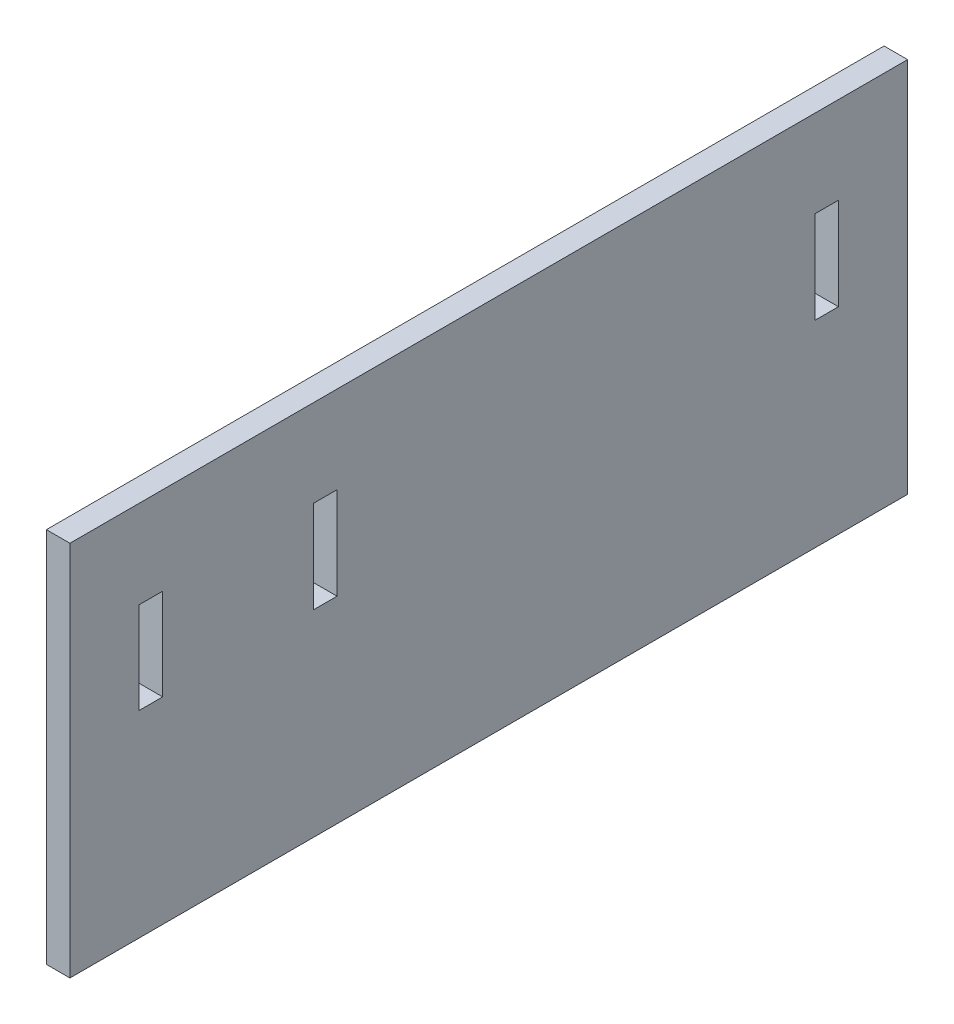
ISO-10303-21;
HEADER;
FILE_DESCRIPTION(('STEP AP214'),'2;1');
FILE_NAME('part.step','',(''),(''),'','','');
FILE_SCHEMA(('AUTOMOTIVE_DESIGN { 1 0 10303 214 1 1 1 1 }'));
ENDSEC;
DATA;
#1=APPLICATION_CONTEXT('core data for automotive mechanical design processes');
#2=APPLICATION_PROTOCOL_DEFINITION('international standard','automotive_design',2000,#1);
#3=PRODUCT_CONTEXT('',#1,'mechanical');
#4=PRODUCT('Part','Part','',(#3));
#5=PRODUCT_RELATED_PRODUCT_CATEGORY('part','',(#4));
#6=PRODUCT_DEFINITION_FORMATION('','',#4);
#7=PRODUCT_DEFINITION_CONTEXT('part definition',#1,'design');
#8=PRODUCT_DEFINITION('design','',#6,#7);
#9=PRODUCT_DEFINITION_SHAPE('','',#8);
#10=(LENGTH_UNIT() NAMED_UNIT(*) SI_UNIT(.MILLI.,.METRE.));
#11=(NAMED_UNIT(*) PLANE_ANGLE_UNIT() SI_UNIT($,.RADIAN.));
#12=(NAMED_UNIT(*) SI_UNIT($,.STERADIAN.) SOLID_ANGLE_UNIT());
#13=UNCERTAINTY_MEASURE_WITH_UNIT(LENGTH_MEASURE(1.E-05),#10,'distance_accuracy_value','');
#14=(GEOMETRIC_REPRESENTATION_CONTEXT(3) GLOBAL_UNCERTAINTY_ASSIGNED_CONTEXT((#13)) GLOBAL_UNIT_ASSIGNED_CONTEXT((#10,
#11,#12)) REPRESENTATION_CONTEXT('',''));
#15=CARTESIAN_POINT('',(0.,0.,0.));
#16=DIRECTION('',(0.,0.,1.));
#17=DIRECTION('',(1.,0.,0.));
#18=AXIS2_PLACEMENT_3D('',#15,#16,#17);
#19=CARTESIAN_POINT('',(2.7,-12.68,1.16249999999997));
#20=DIRECTION('',(1.,0.,0.));
#21=DIRECTION('',(0.,0.,-1.));
#22=AXIS2_PLACEMENT_3D('',#19,#20,#21);
#23=PLANE('',#22);
#24=DIRECTION('',(0.,0.,-1.));
#25=VECTOR('',#24,1.);
#26=CARTESIAN_POINT('',(2.7,9.92264253126034,-26.775));
#27=LINE('',#26,#25);
#28=CARTESIAN_POINT('',(2.7,9.92264253126034,-26.775));
#29=VERTEX_POINT('',#28);
#30=CARTESIAN_POINT('',(2.7,9.92264253126034,-29.475));
#31=VERTEX_POINT('',#30);
#32=EDGE_CURVE('E184',#29,#31,#27,.T.);
#33=ORIENTED_EDGE('',*,*,#32,.F.);
#34=DIRECTION('',(0.,-1.,0.));
#35=VECTOR('',#34,1.);
#36=CARTESIAN_POINT('',(2.7,20.50183849,-26.775));
#37=LINE('',#36,#35);
#38=CARTESIAN_POINT('',(2.7,20.50183849,-26.775));
#39=VERTEX_POINT('',#38);
#40=EDGE_CURVE('E182',#39,#29,#37,.T.);
#41=ORIENTED_EDGE('',*,*,#40,.F.);
#42=DIRECTION('',(0.,0.,1.));
#43=VECTOR('',#42,1.);
#44=CARTESIAN_POINT('',(2.7,20.50183849,-26.775));
#45=LINE('',#44,#43);
#46=CARTESIAN_POINT('',(2.7,20.50183849,-29.475));
#47=VERTEX_POINT('',#46);
#48=EDGE_CURVE('E190',#47,#39,#45,.T.);
#49=ORIENTED_EDGE('',*,*,#48,.F.);
#50=DIRECTION('',(0.,1.,0.));
#51=VECTOR('',#50,1.);
#52=CARTESIAN_POINT('',(2.7,20.50183849,-29.475));
#53=LINE('',#52,#51);
#54=EDGE_CURVE('E187',#31,#47,#53,.T.);
#55=ORIENTED_EDGE('',*,*,#54,.F.);
#56=EDGE_LOOP('',(#33,#41,#49,#55));
#57=FACE_BOUND('',#56,.T.);
#58=DIRECTION('',(0.,0.,-1.));
#59=VECTOR('',#58,1.);
#60=CARTESIAN_POINT('',(2.7,-12.68,-6.77500000000003));
#61=LINE('',#60,#59);
#62=CARTESIAN_POINT('',(2.7,-12.68,1.16249999999997));
#63=VERTEX_POINT('',#62);
#64=CARTESIAN_POINT('',(2.7,-12.68,-94.9125));
#65=VERTEX_POINT('',#64);
#66=EDGE_CURVE('E244',#63,#65,#61,.T.);
#67=ORIENTED_EDGE('',*,*,#66,.T.);
#68=DIRECTION('',(0.,1.,0.));
#69=VECTOR('',#68,1.);
#70=CARTESIAN_POINT('',(2.7,30.5,-94.9125));
#71=LINE('',#70,#69);
#72=CARTESIAN_POINT('',(2.7,30.5,-94.9125));
#73=VERTEX_POINT('',#72);
#74=EDGE_CURVE('E246',#65,#73,#71,.T.);
#75=ORIENTED_EDGE('',*,*,#74,.T.);
#76=DIRECTION('',(0.,0.,1.));
#77=VECTOR('',#76,1.);
#78=CARTESIAN_POINT('',(2.7,30.5,-83.4125));
#79=LINE('',#78,#77);
#80=CARTESIAN_POINT('',(2.7,30.5,1.16249999999997));
#81=VERTEX_POINT('',#80);
#82=EDGE_CURVE('E249',#73,#81,#79,.T.);
#83=ORIENTED_EDGE('',*,*,#82,.T.);
#84=DIRECTION('',(0.,-1.,0.));
#85=VECTOR('',#84,1.);
#86=CARTESIAN_POINT('',(2.7,30.5,1.16249999999997));
#87=LINE('',#86,#85);
#88=EDGE_CURVE('E251',#81,#63,#87,.T.);
#89=ORIENTED_EDGE('',*,*,#88,.T.);
#90=EDGE_LOOP('',(#67,#75,#83,#89));
#91=FACE_BOUND('',#90,.T.);
#92=DIRECTION('',(0.,0.,-1.));
#93=VECTOR('',#92,1.);
#94=CARTESIAN_POINT('',(2.7,9.92264253126034,-6.77500000000003));
#95=LINE('',#94,#93);
#96=CARTESIAN_POINT('',(2.7,9.92264253126034,-6.77500000000003));
#97=VERTEX_POINT('',#96);
#98=CARTESIAN_POINT('',(2.7,9.92264253126034,-9.47500000000004));
#99=VERTEX_POINT('',#98);
#100=EDGE_CURVE('E215',#97,#99,#95,.T.);
#101=ORIENTED_EDGE('',*,*,#100,.F.);
#102=DIRECTION('',(0.,-1.,0.));
#103=VECTOR('',#102,1.);
#104=CARTESIAN_POINT('',(2.7,20.4226425312603,-6.77500000000003));
#105=LINE('',#104,#103);
#106=CARTESIAN_POINT('',(2.7,20.4226425312603,-6.77500000000003));
#107=VERTEX_POINT('',#106);
#108=EDGE_CURVE('E213',#107,#97,#105,.T.);
#109=ORIENTED_EDGE('',*,*,#108,.F.);
#110=DIRECTION('',(0.,0.,1.));
#111=VECTOR('',#110,1.);
#112=CARTESIAN_POINT('',(2.7,20.4226425312603,-9.47500000000003));
#113=LINE('',#112,#111);
#114=CARTESIAN_POINT('',(2.7,20.4226425312603,-9.47500000000003));
#115=VERTEX_POINT('',#114);
#116=EDGE_CURVE('E221',#115,#107,#113,.T.);
#117=ORIENTED_EDGE('',*,*,#116,.F.);
#118=DIRECTION('',(0.,1.,0.));
#119=VECTOR('',#118,1.);
#120=CARTESIAN_POINT('',(2.7,9.92264253126034,-9.47500000000004));
#121=LINE('',#120,#119);
#122=EDGE_CURVE('E218',#99,#115,#121,.T.);
#123=ORIENTED_EDGE('',*,*,#122,.F.);
#124=EDGE_LOOP('',(#101,#109,#117,#123));
#125=FACE_BOUND('',#124,.T.);
#126=DIRECTION('',(0.,0.,1.));
#127=VECTOR('',#126,1.);
#128=CARTESIAN_POINT('',(2.7,20.50183849,-86.975));
#129=LINE('',#128,#127);
#130=CARTESIAN_POINT('',(2.7,20.50183849,-86.975));
#131=VERTEX_POINT('',#130);
#132=CARTESIAN_POINT('',(2.7,20.50183849,-84.275));
#133=VERTEX_POINT('',#132);
#134=EDGE_CURVE('E154',#131,#133,#129,.T.);
#135=ORIENTED_EDGE('',*,*,#134,.F.);
#136=DIRECTION('',(0.,1.,0.));
#137=VECTOR('',#136,1.);
#138=CARTESIAN_POINT('',(2.7,20.50183849,-86.975));
#139=LINE('',#138,#137);
#140=CARTESIAN_POINT('',(2.7,9.92264253126034,-86.975));
#141=VERTEX_POINT('',#140);
#142=EDGE_CURVE('E146',#141,#131,#139,.T.);
#143=ORIENTED_EDGE('',*,*,#142,.F.);
#144=DIRECTION('',(0.,0.,-1.));
#145=VECTOR('',#144,1.);
#146=CARTESIAN_POINT('',(2.7,9.92264253126034,-84.275));
#147=LINE('',#146,#145);
#148=CARTESIAN_POINT('',(2.7,9.92264253126034,-84.275));
#149=VERTEX_POINT('',#148);
#150=EDGE_CURVE('E168',#149,#141,#147,.T.);
#151=ORIENTED_EDGE('',*,*,#150,.F.);
#152=DIRECTION('',(0.,-1.,0.));
#153=VECTOR('',#152,1.);
#154=CARTESIAN_POINT('',(2.7,20.50183849,-84.275));
#155=LINE('',#154,#153);
#156=EDGE_CURVE('E166',#133,#149,#155,.T.);
#157=ORIENTED_EDGE('',*,*,#156,.F.);
#158=EDGE_LOOP('',(#135,#143,#151,#157));
#159=FACE_BOUND('',#158,.T.);
#160=ADVANCED_FACE('F33',(#57,#91,#125,#159),#23,.T.);
#161=CARTESIAN_POINT('',(0.,-12.68,1.16249999999997));
#162=DIRECTION('',(1.,0.,0.));
#163=DIRECTION('',(0.,0.,-1.));
#164=AXIS2_PLACEMENT_3D('',#161,#162,#163);
#165=PLANE('',#164);
#166=DIRECTION('',(0.,-1.,0.));
#167=VECTOR('',#166,1.);
#168=CARTESIAN_POINT('',(0.,20.50183849,-26.775));
#169=LINE('',#168,#167);
#170=CARTESIAN_POINT('',(0.,20.50183849,-26.775));
#171=VERTEX_POINT('',#170);
#172=CARTESIAN_POINT('',(0.,9.92264253126034,-26.775));
#173=VERTEX_POINT('',#172);
#174=EDGE_CURVE('E162',#171,#173,#169,.T.);
#175=ORIENTED_EDGE('',*,*,#174,.T.);
#176=DIRECTION('',(0.,0.,-1.));
#177=VECTOR('',#176,1.);
#178=CARTESIAN_POINT('',(0.,9.92264253126034,-26.775));
#179=LINE('',#178,#177);
#180=CARTESIAN_POINT('',(0.,9.92264253126034,-29.475));
#181=VERTEX_POINT('',#180);
#182=EDGE_CURVE('E195',#173,#181,#179,.T.);
#183=ORIENTED_EDGE('',*,*,#182,.T.);
#184=DIRECTION('',(0.,1.,0.));
#185=VECTOR('',#184,1.);
#186=CARTESIAN_POINT('',(0.,20.50183849,-29.475));
#187=LINE('',#186,#185);
#188=CARTESIAN_POINT('',(0.,20.50183849,-29.475));
#189=VERTEX_POINT('',#188);
#190=EDGE_CURVE('E198',#181,#189,#187,.T.);
#191=ORIENTED_EDGE('',*,*,#190,.T.);
#192=DIRECTION('',(0.,0.,1.));
#193=VECTOR('',#192,1.);
#194=CARTESIAN_POINT('',(0.,20.50183849,-26.775));
#195=LINE('',#194,#193);
#196=EDGE_CURVE('E185',#189,#171,#195,.T.);
#197=ORIENTED_EDGE('',*,*,#196,.T.);
#198=EDGE_LOOP('',(#175,#183,#191,#197));
#199=FACE_BOUND('',#198,.T.);
#200=DIRECTION('',(0.,0.,-1.));
#201=VECTOR('',#200,1.);
#202=CARTESIAN_POINT('',(0.,-12.68,-86.975));
#203=LINE('',#202,#201);
#204=CARTESIAN_POINT('',(0.,-12.68,1.16249999999997));
#205=VERTEX_POINT('',#204);
#206=CARTESIAN_POINT('',(0.,-12.68,-94.9125));
#207=VERTEX_POINT('',#206);
#208=EDGE_CURVE('E243',#205,#207,#203,.T.);
#209=ORIENTED_EDGE('',*,*,#208,.F.);
#210=DIRECTION('',(0.,-1.,0.));
#211=VECTOR('',#210,1.);
#212=CARTESIAN_POINT('',(0.,30.5,1.16249999999997));
#213=LINE('',#212,#211);
#214=CARTESIAN_POINT('',(0.,30.5,1.16249999999997));
#215=VERTEX_POINT('',#214);
#216=EDGE_CURVE('E247',#215,#205,#213,.T.);
#217=ORIENTED_EDGE('',*,*,#216,.F.);
#218=DIRECTION('',(0.,0.,1.));
#219=VECTOR('',#218,1.);
#220=CARTESIAN_POINT('',(0.,30.5,-3.21249999999999));
#221=LINE('',#220,#219);
#222=CARTESIAN_POINT('',(0.,30.5,-94.9125));
#223=VERTEX_POINT('',#222);
#224=EDGE_CURVE('E258',#223,#215,#221,.T.);
#225=ORIENTED_EDGE('',*,*,#224,.F.);
#226=DIRECTION('',(0.,1.,0.));
#227=VECTOR('',#226,1.);
#228=CARTESIAN_POINT('',(0.,30.5,-94.9125));
#229=LINE('',#228,#227);
#230=EDGE_CURVE('E255',#207,#223,#229,.T.);
#231=ORIENTED_EDGE('',*,*,#230,.F.);
#232=EDGE_LOOP('',(#209,#217,#225,#231));
#233=FACE_BOUND('',#232,.T.);
#234=DIRECTION('',(0.,-1.,0.));
#235=VECTOR('',#234,1.);
#236=CARTESIAN_POINT('',(0.,20.4226425312603,-6.77500000000003));
#237=LINE('',#236,#235);
#238=CARTESIAN_POINT('',(0.,20.4226425312603,-6.77500000000003));
#239=VERTEX_POINT('',#238);
#240=CARTESIAN_POINT('',(0.,9.92264253126034,-6.77500000000003));
#241=VERTEX_POINT('',#240);
#242=EDGE_CURVE('E212',#239,#241,#237,.T.);
#243=ORIENTED_EDGE('',*,*,#242,.T.);
#244=DIRECTION('',(0.,0.,-1.));
#245=VECTOR('',#244,1.);
#246=CARTESIAN_POINT('',(0.,9.92264253126034,-6.77500000000003));
#247=LINE('',#246,#245);
#248=CARTESIAN_POINT('',(0.,9.92264253126034,-9.47500000000004));
#249=VERTEX_POINT('',#248);
#250=EDGE_CURVE('E226',#241,#249,#247,.T.);
#251=ORIENTED_EDGE('',*,*,#250,.T.);
#252=DIRECTION('',(0.,1.,0.));
#253=VECTOR('',#252,1.);
#254=CARTESIAN_POINT('',(0.,9.92264253126034,-9.47500000000004));
#255=LINE('',#254,#253);
#256=CARTESIAN_POINT('',(0.,20.4226425312603,-9.47500000000003));
#257=VERTEX_POINT('',#256);
#258=EDGE_CURVE('E229',#249,#257,#255,.T.);
#259=ORIENTED_EDGE('',*,*,#258,.T.);
#260=DIRECTION('',(0.,0.,1.));
#261=VECTOR('',#260,1.);
#262=CARTESIAN_POINT('',(0.,20.4226425312603,-9.47500000000003));
#263=LINE('',#262,#261);
#264=EDGE_CURVE('E216',#257,#239,#263,.T.);
#265=ORIENTED_EDGE('',*,*,#264,.T.);
#266=EDGE_LOOP('',(#243,#251,#259,#265));
#267=FACE_BOUND('',#266,.T.);
#268=DIRECTION('',(0.,1.,0.));
#269=VECTOR('',#268,1.);
#270=CARTESIAN_POINT('',(0.,20.50183849,-86.975));
#271=LINE('',#270,#269);
#272=CARTESIAN_POINT('',(0.,9.92264253126034,-86.975));
#273=VERTEX_POINT('',#272);
#274=CARTESIAN_POINT('',(0.,20.50183849,-86.975));
#275=VERTEX_POINT('',#274);
#276=EDGE_CURVE('E56',#273,#275,#271,.T.);
#277=ORIENTED_EDGE('',*,*,#276,.T.);
#278=DIRECTION('',(0.,0.,1.));
#279=VECTOR('',#278,1.);
#280=CARTESIAN_POINT('',(0.,20.50183849,-86.975));
#281=LINE('',#280,#279);
#282=CARTESIAN_POINT('',(0.,20.50183849,-84.275));
#283=VERTEX_POINT('',#282);
#284=EDGE_CURVE('E161',#275,#283,#281,.T.);
#285=ORIENTED_EDGE('',*,*,#284,.T.);
#286=DIRECTION('',(0.,-1.,0.));
#287=VECTOR('',#286,1.);
#288=CARTESIAN_POINT('',(0.,20.50183849,-84.275));
#289=LINE('',#288,#287);
#290=CARTESIAN_POINT('',(0.,9.92264253126034,-84.275));
#291=VERTEX_POINT('',#290);
#292=EDGE_CURVE('E174',#283,#291,#289,.T.);
#293=ORIENTED_EDGE('',*,*,#292,.T.);
#294=DIRECTION('',(0.,0.,-1.));
#295=VECTOR('',#294,1.);
#296=CARTESIAN_POINT('',(0.,9.92264253126034,-84.275));
#297=LINE('',#296,#295);
#298=EDGE_CURVE('E155',#291,#273,#297,.T.);
#299=ORIENTED_EDGE('',*,*,#298,.T.);
#300=EDGE_LOOP('',(#277,#285,#293,#299));
#301=FACE_BOUND('',#300,.T.);
#302=ADVANCED_FACE('F278',(#199,#233,#267,#301),#165,.F.);
#303=CARTESIAN_POINT('',(2.7,-12.68,-86.975));
#304=DIRECTION('',(0.,1.,0.));
#305=DIRECTION('',(0.,0.,1.));
#306=AXIS2_PLACEMENT_3D('',#303,#304,#305);
#307=PLANE('',#306);
#308=ORIENTED_EDGE('',*,*,#208,.T.);
#309=DIRECTION('',(-1.,0.,0.));
#310=VECTOR('',#309,1.);
#311=CARTESIAN_POINT('',(2.7,-12.68,-94.9125));
#312=LINE('',#311,#310);
#313=EDGE_CURVE('E11',#65,#207,#312,.T.);
#314=ORIENTED_EDGE('',*,*,#313,.F.);
#315=ORIENTED_EDGE('',*,*,#66,.F.);
#316=DIRECTION('',(-1.,0.,0.));
#317=VECTOR('',#316,1.);
#318=CARTESIAN_POINT('',(2.7,-12.68,1.16249999999997));
#319=LINE('',#318,#317);
#320=EDGE_CURVE('E253',#63,#205,#319,.T.);
#321=ORIENTED_EDGE('',*,*,#320,.T.);
#322=EDGE_LOOP('',(#308,#314,#315,#321));
#323=FACE_BOUND('',#322,.T.);
#324=ADVANCED_FACE('F35',(#323),#307,.F.);
#325=CARTESIAN_POINT('',(2.7,30.5,-94.9125));
#326=DIRECTION('',(0.,0.,1.));
#327=DIRECTION('',(1.,0.,0.));
#328=AXIS2_PLACEMENT_3D('',#325,#326,#327);
#329=PLANE('',#328);
#330=ORIENTED_EDGE('',*,*,#230,.T.);
#331=DIRECTION('',(-1.,0.,0.));
#332=VECTOR('',#331,1.);
#333=CARTESIAN_POINT('',(2.7,30.5,-94.9125));
#334=LINE('',#333,#332);
#335=EDGE_CURVE('E41',#73,#223,#334,.T.);
#336=ORIENTED_EDGE('',*,*,#335,.F.);
#337=ORIENTED_EDGE('',*,*,#74,.F.);
#338=ORIENTED_EDGE('',*,*,#313,.T.);
#339=EDGE_LOOP('',(#330,#336,#337,#338));
#340=FACE_BOUND('',#339,.T.);
#341=ADVANCED_FACE('F274',(#340),#329,.F.);
#342=CARTESIAN_POINT('',(2.7,30.5,-3.21249999999999));
#343=DIRECTION('',(0.,-1.,0.));
#344=DIRECTION('',(0.,0.,-1.));
#345=AXIS2_PLACEMENT_3D('',#342,#343,#344);
#346=PLANE('',#345);
#347=ORIENTED_EDGE('',*,*,#224,.T.);
#348=DIRECTION('',(-1.,0.,0.));
#349=VECTOR('',#348,1.);
#350=CARTESIAN_POINT('',(2.7,30.5,1.16249999999997));
#351=LINE('',#350,#349);
#352=EDGE_CURVE('E264',#81,#215,#351,.T.);
#353=ORIENTED_EDGE('',*,*,#352,.F.);
#354=ORIENTED_EDGE('',*,*,#82,.F.);
#355=ORIENTED_EDGE('',*,*,#335,.T.);
#356=EDGE_LOOP('',(#347,#353,#354,#355));
#357=FACE_BOUND('',#356,.T.);
#358=ADVANCED_FACE('F270',(#357),#346,.F.);
#359=CARTESIAN_POINT('',(2.7,30.5,1.16249999999997));
#360=DIRECTION('',(0.,0.,-1.));
#361=DIRECTION('',(0.,1.,0.));
#362=AXIS2_PLACEMENT_3D('',#359,#360,#361);
#363=PLANE('',#362);
#364=ORIENTED_EDGE('',*,*,#216,.T.);
#365=ORIENTED_EDGE('',*,*,#320,.F.);
#366=ORIENTED_EDGE('',*,*,#88,.F.);
#367=ORIENTED_EDGE('',*,*,#352,.T.);
#368=EDGE_LOOP('',(#364,#365,#366,#367));
#369=FACE_BOUND('',#368,.T.);
#370=ADVANCED_FACE('F283',(#369),#363,.F.);
#371=CARTESIAN_POINT('',(2.7,20.4226425312603,-6.77500000000003));
#372=DIRECTION('',(0.,0.,-1.));
#373=DIRECTION('',(-1.,0.,0.));
#374=AXIS2_PLACEMENT_3D('',#371,#372,#373);
#375=PLANE('',#374);
#376=ORIENTED_EDGE('',*,*,#242,.F.);
#377=DIRECTION('',(-1.,0.,0.));
#378=VECTOR('',#377,1.);
#379=CARTESIAN_POINT('',(2.7,20.4226425312603,-6.77500000000003));
#380=LINE('',#379,#378);
#381=EDGE_CURVE('E223',#107,#239,#380,.T.);
#382=ORIENTED_EDGE('',*,*,#381,.F.);
#383=ORIENTED_EDGE('',*,*,#108,.T.);
#384=DIRECTION('',(-1.,0.,0.));
#385=VECTOR('',#384,1.);
#386=CARTESIAN_POINT('',(2.7,9.92264253126034,-6.77500000000003));
#387=LINE('',#386,#385);
#388=EDGE_CURVE('E240',#97,#241,#387,.T.);
#389=ORIENTED_EDGE('',*,*,#388,.T.);
#390=EDGE_LOOP('',(#376,#382,#383,#389));
#391=FACE_BOUND('',#390,.T.);
#392=ADVANCED_FACE('F306',(#391),#375,.T.);
#393=CARTESIAN_POINT('',(2.7,9.92264253126034,-6.77500000000003));
#394=DIRECTION('',(0.,1.,0.));
#395=DIRECTION('',(0.,0.,1.));
#396=AXIS2_PLACEMENT_3D('',#393,#394,#395);
#397=PLANE('',#396);
#398=ORIENTED_EDGE('',*,*,#250,.F.);
#399=ORIENTED_EDGE('',*,*,#388,.F.);
#400=ORIENTED_EDGE('',*,*,#100,.T.);
#401=DIRECTION('',(-1.,0.,0.));
#402=VECTOR('',#401,1.);
#403=CARTESIAN_POINT('',(2.7,9.92264253126034,-9.47500000000004));
#404=LINE('',#403,#402);
#405=EDGE_CURVE('E238',#99,#249,#404,.T.);
#406=ORIENTED_EDGE('',*,*,#405,.T.);
#407=EDGE_LOOP('',(#398,#399,#400,#406));
#408=FACE_BOUND('',#407,.T.);
#409=ADVANCED_FACE('F299',(#408),#397,.T.);
#410=CARTESIAN_POINT('',(2.7,9.92264253126034,-9.47500000000004));
#411=DIRECTION('',(0.,0.,1.));
#412=DIRECTION('',(0.,-1.,0.));
#413=AXIS2_PLACEMENT_3D('',#410,#411,#412);
#414=PLANE('',#413);
#415=ORIENTED_EDGE('',*,*,#258,.F.);
#416=ORIENTED_EDGE('',*,*,#405,.F.);
#417=ORIENTED_EDGE('',*,*,#122,.T.);
#418=DIRECTION('',(-1.,0.,0.));
#419=VECTOR('',#418,1.);
#420=CARTESIAN_POINT('',(2.7,20.4226425312603,-9.47500000000003));
#421=LINE('',#420,#419);
#422=EDGE_CURVE('E236',#115,#257,#421,.T.);
#423=ORIENTED_EDGE('',*,*,#422,.T.);
#424=EDGE_LOOP('',(#415,#416,#417,#423));
#425=FACE_BOUND('',#424,.T.);
#426=ADVANCED_FACE('F302',(#425),#414,.T.);
#427=CARTESIAN_POINT('',(2.7,20.4226425312603,-9.47500000000003));
#428=DIRECTION('',(0.,-1.,0.));
#429=DIRECTION('',(0.,0.,-1.));
#430=AXIS2_PLACEMENT_3D('',#427,#428,#429);
#431=PLANE('',#430);
#432=ORIENTED_EDGE('',*,*,#264,.F.);
#433=ORIENTED_EDGE('',*,*,#422,.F.);
#434=ORIENTED_EDGE('',*,*,#116,.T.);
#435=ORIENTED_EDGE('',*,*,#381,.T.);
#436=EDGE_LOOP('',(#432,#433,#434,#435));
#437=FACE_BOUND('',#436,.T.);
#438=ADVANCED_FACE('F309',(#437),#431,.T.);
#439=CARTESIAN_POINT('',(2.7,20.50183849,-26.775));
#440=DIRECTION('',(0.,0.,-1.));
#441=DIRECTION('',(0.,1.,0.));
#442=AXIS2_PLACEMENT_3D('',#439,#440,#441);
#443=PLANE('',#442);
#444=ORIENTED_EDGE('',*,*,#174,.F.);
#445=DIRECTION('',(-1.,0.,0.));
#446=VECTOR('',#445,1.);
#447=CARTESIAN_POINT('',(2.7,20.50183849,-26.775));
#448=LINE('',#447,#446);
#449=EDGE_CURVE('E192',#39,#171,#448,.T.);
#450=ORIENTED_EDGE('',*,*,#449,.F.);
#451=ORIENTED_EDGE('',*,*,#40,.T.);
#452=DIRECTION('',(-1.,0.,0.));
#453=VECTOR('',#452,1.);
#454=CARTESIAN_POINT('',(2.7,9.92264253126034,-26.775));
#455=LINE('',#454,#453);
#456=EDGE_CURVE('E209',#29,#173,#455,.T.);
#457=ORIENTED_EDGE('',*,*,#456,.T.);
#458=EDGE_LOOP('',(#444,#450,#451,#457));
#459=FACE_BOUND('',#458,.T.);
#460=ADVANCED_FACE('F311',(#459),#443,.T.);
#461=CARTESIAN_POINT('',(2.7,9.92264253126034,-26.775));
#462=DIRECTION('',(0.,1.,0.));
#463=DIRECTION('',(0.,0.,1.));
#464=AXIS2_PLACEMENT_3D('',#461,#462,#463);
#465=PLANE('',#464);
#466=ORIENTED_EDGE('',*,*,#182,.F.);
#467=ORIENTED_EDGE('',*,*,#456,.F.);
#468=ORIENTED_EDGE('',*,*,#32,.T.);
#469=DIRECTION('',(-1.,0.,0.));
#470=VECTOR('',#469,1.);
#471=CARTESIAN_POINT('',(2.7,9.92264253126034,-29.475));
#472=LINE('',#471,#470);
#473=EDGE_CURVE('E207',#31,#181,#472,.T.);
#474=ORIENTED_EDGE('',*,*,#473,.T.);
#475=EDGE_LOOP('',(#466,#467,#468,#474));
#476=FACE_BOUND('',#475,.T.);
#477=ADVANCED_FACE('F317',(#476),#465,.T.);
#478=CARTESIAN_POINT('',(2.7,20.50183849,-29.475));
#479=DIRECTION('',(0.,0.,1.));
#480=DIRECTION('',(1.,0.,0.));
#481=AXIS2_PLACEMENT_3D('',#478,#479,#480);
#482=PLANE('',#481);
#483=ORIENTED_EDGE('',*,*,#190,.F.);
#484=ORIENTED_EDGE('',*,*,#473,.F.);
#485=ORIENTED_EDGE('',*,*,#54,.T.);
#486=DIRECTION('',(-1.,0.,0.));
#487=VECTOR('',#486,1.);
#488=CARTESIAN_POINT('',(2.7,20.50183849,-29.475));
#489=LINE('',#488,#487);
#490=EDGE_CURVE('E205',#47,#189,#489,.T.);
#491=ORIENTED_EDGE('',*,*,#490,.T.);
#492=EDGE_LOOP('',(#483,#484,#485,#491));
#493=FACE_BOUND('',#492,.T.);
#494=ADVANCED_FACE('F411',(#493),#482,.T.);
#495=CARTESIAN_POINT('',(2.7,20.50183849,-26.775));
#496=DIRECTION('',(0.,-1.,0.));
#497=DIRECTION('',(0.,0.,-1.));
#498=AXIS2_PLACEMENT_3D('',#495,#496,#497);
#499=PLANE('',#498);
#500=ORIENTED_EDGE('',*,*,#196,.F.);
#501=ORIENTED_EDGE('',*,*,#490,.F.);
#502=ORIENTED_EDGE('',*,*,#48,.T.);
#503=ORIENTED_EDGE('',*,*,#449,.T.);
#504=EDGE_LOOP('',(#500,#501,#502,#503));
#505=FACE_BOUND('',#504,.T.);
#506=ADVANCED_FACE('F419',(#505),#499,.T.);
#507=CARTESIAN_POINT('',(2.7,20.50183849,-86.975));
#508=DIRECTION('',(0.,0.,1.));
#509=DIRECTION('',(1.,0.,0.));
#510=AXIS2_PLACEMENT_3D('',#507,#508,#509);
#511=PLANE('',#510);
#512=ORIENTED_EDGE('',*,*,#276,.F.);
#513=DIRECTION('',(-1.,0.,0.));
#514=VECTOR('',#513,1.);
#515=CARTESIAN_POINT('',(2.7,9.92264253126034,-86.975));
#516=LINE('',#515,#514);
#517=EDGE_CURVE('E150',#141,#273,#516,.T.);
#518=ORIENTED_EDGE('',*,*,#517,.F.);
#519=ORIENTED_EDGE('',*,*,#142,.T.);
#520=DIRECTION('',(-1.,0.,0.));
#521=VECTOR('',#520,1.);
#522=CARTESIAN_POINT('',(2.7,20.50183849,-86.975));
#523=LINE('',#522,#521);
#524=EDGE_CURVE('E149',#131,#275,#523,.T.);
#525=ORIENTED_EDGE('',*,*,#524,.T.);
#526=EDGE_LOOP('',(#512,#518,#519,#525));
#527=FACE_BOUND('',#526,.T.);
#528=ADVANCED_FACE('F148',(#527),#511,.T.);
#529=CARTESIAN_POINT('',(2.7,20.50183849,-86.975));
#530=DIRECTION('',(0.,-1.,0.));
#531=DIRECTION('',(0.,0.,-1.));
#532=AXIS2_PLACEMENT_3D('',#529,#530,#531);
#533=PLANE('',#532);
#534=ORIENTED_EDGE('',*,*,#284,.F.);
#535=ORIENTED_EDGE('',*,*,#524,.F.);
#536=ORIENTED_EDGE('',*,*,#134,.T.);
#537=DIRECTION('',(-1.,0.,0.));
#538=VECTOR('',#537,1.);
#539=CARTESIAN_POINT('',(2.7,20.50183849,-84.275));
#540=LINE('',#539,#538);
#541=EDGE_CURVE('E163',#133,#283,#540,.T.);
#542=ORIENTED_EDGE('',*,*,#541,.T.);
#543=EDGE_LOOP('',(#534,#535,#536,#542));
#544=FACE_BOUND('',#543,.T.);
#545=ADVANCED_FACE('F158',(#544),#533,.T.);
#546=CARTESIAN_POINT('',(2.7,20.50183849,-84.275));
#547=DIRECTION('',(0.,0.,-1.));
#548=DIRECTION('',(-1.,0.,0.));
#549=AXIS2_PLACEMENT_3D('',#546,#547,#548);
#550=PLANE('',#549);
#551=ORIENTED_EDGE('',*,*,#292,.F.);
#552=ORIENTED_EDGE('',*,*,#541,.F.);
#553=ORIENTED_EDGE('',*,*,#156,.T.);
#554=DIRECTION('',(-1.,0.,0.));
#555=VECTOR('',#554,1.);
#556=CARTESIAN_POINT('',(2.7,9.92264253126034,-84.275));
#557=LINE('',#556,#555);
#558=EDGE_CURVE('E48',#149,#291,#557,.T.);
#559=ORIENTED_EDGE('',*,*,#558,.T.);
#560=EDGE_LOOP('',(#551,#552,#553,#559));
#561=FACE_BOUND('',#560,.T.);
#562=ADVANCED_FACE('F443',(#561),#550,.T.);
#563=CARTESIAN_POINT('',(2.7,9.92264253126034,-84.275));
#564=DIRECTION('',(0.,1.,0.));
#565=DIRECTION('',(0.,0.,1.));
#566=AXIS2_PLACEMENT_3D('',#563,#564,#565);
#567=PLANE('',#566);
#568=ORIENTED_EDGE('',*,*,#298,.F.);
#569=ORIENTED_EDGE('',*,*,#558,.F.);
#570=ORIENTED_EDGE('',*,*,#150,.T.);
#571=ORIENTED_EDGE('',*,*,#517,.T.);
#572=EDGE_LOOP('',(#568,#569,#570,#571));
#573=FACE_BOUND('',#572,.T.);
#574=ADVANCED_FACE('F451',(#573),#567,.T.);
#575=CLOSED_SHELL('',(#160,#302,#324,#341,#358,#370,#392,#409,#426,#438,#460,#477,#494,#506,
#528,#545,#562,#574));
#576=MANIFOLD_SOLID_BREP('B2',#575);
#577=ADVANCED_BREP_SHAPE_REPRESENTATION('',(#18,#576),#14);
#578=SHAPE_DEFINITION_REPRESENTATION(#9,#577);
ENDSEC;
END-ISO-10303-21;
